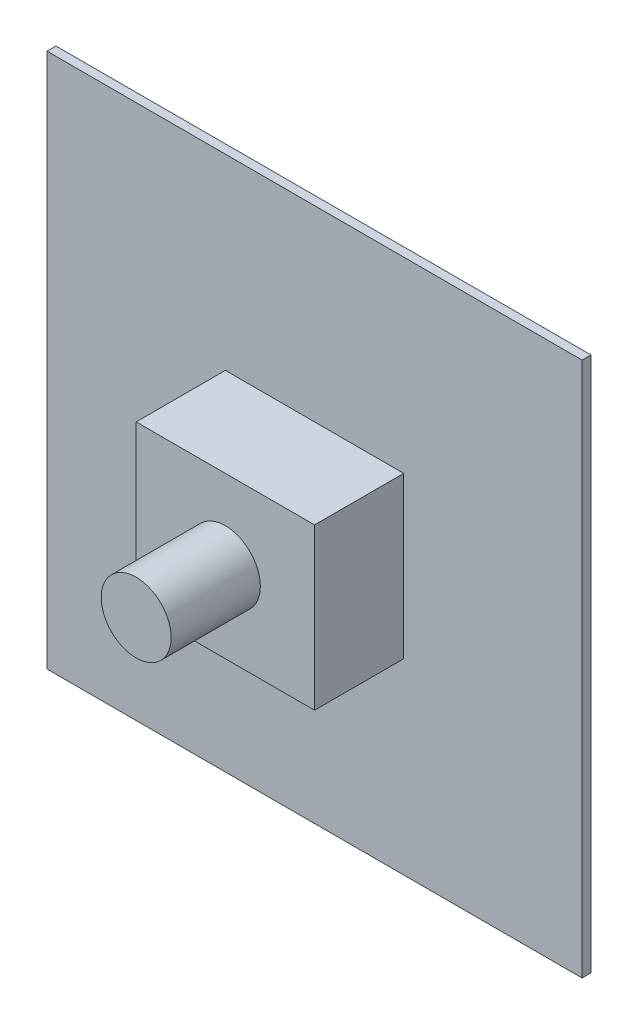
ISO-10303-21;
HEADER;
FILE_DESCRIPTION(('STEP AP214'),'2;1');
FILE_NAME('part.step','',(''),(''),'','','');
FILE_SCHEMA(('AUTOMOTIVE_DESIGN { 1 0 10303 214 1 1 1 1 }'));
ENDSEC;
DATA;
#1=APPLICATION_CONTEXT('core data for automotive mechanical design processes');
#2=APPLICATION_PROTOCOL_DEFINITION('international standard','automotive_design',2000,#1);
#3=PRODUCT_CONTEXT('',#1,'mechanical');
#4=PRODUCT('Part','Part','',(#3));
#5=PRODUCT_RELATED_PRODUCT_CATEGORY('part','',(#4));
#6=PRODUCT_DEFINITION_FORMATION('','',#4);
#7=PRODUCT_DEFINITION_CONTEXT('part definition',#1,'design');
#8=PRODUCT_DEFINITION('design','',#6,#7);
#9=PRODUCT_DEFINITION_SHAPE('','',#8);
#10=(LENGTH_UNIT() NAMED_UNIT(*) SI_UNIT(.MILLI.,.METRE.));
#11=(NAMED_UNIT(*) PLANE_ANGLE_UNIT() SI_UNIT($,.RADIAN.));
#12=(NAMED_UNIT(*) SI_UNIT($,.STERADIAN.) SOLID_ANGLE_UNIT());
#13=UNCERTAINTY_MEASURE_WITH_UNIT(LENGTH_MEASURE(1.E-05),#10,'distance_accuracy_value','');
#14=(GEOMETRIC_REPRESENTATION_CONTEXT(3) GLOBAL_UNCERTAINTY_ASSIGNED_CONTEXT((#13)) GLOBAL_UNIT_ASSIGNED_CONTEXT((#10,
#11,#12)) REPRESENTATION_CONTEXT('',''));
#15=CARTESIAN_POINT('',(0.,0.,0.));
#16=DIRECTION('',(0.,0.,1.));
#17=DIRECTION('',(1.,0.,0.));
#18=AXIS2_PLACEMENT_3D('',#15,#16,#17);
#19=CARTESIAN_POINT('',(0.,0.,50.));
#20=DIRECTION('',(0.,0.,1.));
#21=DIRECTION('',(1.,0.,0.));
#22=AXIS2_PLACEMENT_3D('',#19,#20,#21);
#23=PLANE('',#22);
#24=DIRECTION('',(0.,1.,0.));
#25=VECTOR('',#24,1.);
#26=CARTESIAN_POINT('',(1500.,1500.,50.));
#27=LINE('',#26,#25);
#28=CARTESIAN_POINT('',(1500.,-1500.,50.));
#29=VERTEX_POINT('',#28);
#30=CARTESIAN_POINT('',(1500.,1500.,50.));
#31=VERTEX_POINT('',#30);
#32=EDGE_CURVE('E140',#29,#31,#27,.T.);
#33=ORIENTED_EDGE('',*,*,#32,.T.);
#34=DIRECTION('',(-1.,0.,0.));
#35=VECTOR('',#34,1.);
#36=CARTESIAN_POINT('',(-1500.,1500.,50.));
#37=LINE('',#36,#35);
#38=CARTESIAN_POINT('',(-1500.,1500.,50.));
#39=VERTEX_POINT('',#38);
#40=EDGE_CURVE('E85',#31,#39,#37,.T.);
#41=ORIENTED_EDGE('',*,*,#40,.T.);
#42=DIRECTION('',(0.,-1.,0.));
#43=VECTOR('',#42,1.);
#44=CARTESIAN_POINT('',(-1500.,1500.,50.));
#45=LINE('',#44,#43);
#46=CARTESIAN_POINT('',(-1500.,-1500.,50.));
#47=VERTEX_POINT('',#46);
#48=EDGE_CURVE('E143',#39,#47,#45,.T.);
#49=ORIENTED_EDGE('',*,*,#48,.T.);
#50=DIRECTION('',(1.,0.,0.));
#51=VECTOR('',#50,1.);
#52=CARTESIAN_POINT('',(-1500.,-1500.,50.));
#53=LINE('',#52,#51);
#54=EDGE_CURVE('E57',#47,#29,#53,.T.);
#55=ORIENTED_EDGE('',*,*,#54,.T.);
#56=EDGE_LOOP('',(#33,#41,#49,#55));
#57=FACE_BOUND('',#56,.T.);
#58=DIRECTION('',(-1.,0.,0.));
#59=VECTOR('',#58,1.);
#60=CARTESIAN_POINT('',(-500.,450.,50.));
#61=LINE('',#60,#59);
#62=CARTESIAN_POINT('',(500.,450.,50.));
#63=VERTEX_POINT('',#62);
#64=CARTESIAN_POINT('',(-500.,450.,50.));
#65=VERTEX_POINT('',#64);
#66=EDGE_CURVE('E210',#63,#65,#61,.T.);
#67=ORIENTED_EDGE('',*,*,#66,.F.);
#68=DIRECTION('',(0.,1.,0.));
#69=VECTOR('',#68,1.);
#70=CARTESIAN_POINT('',(500.,450.,50.));
#71=LINE('',#70,#69);
#72=CARTESIAN_POINT('',(500.,-450.,50.));
#73=VERTEX_POINT('',#72);
#74=EDGE_CURVE('E130',#73,#63,#71,.T.);
#75=ORIENTED_EDGE('',*,*,#74,.F.);
#76=DIRECTION('',(1.,0.,0.));
#77=VECTOR('',#76,1.);
#78=CARTESIAN_POINT('',(-500.,-450.,50.));
#79=LINE('',#78,#77);
#80=CARTESIAN_POINT('',(-500.,-450.,50.));
#81=VERTEX_POINT('',#80);
#82=EDGE_CURVE('E126',#81,#73,#79,.T.);
#83=ORIENTED_EDGE('',*,*,#82,.F.);
#84=DIRECTION('',(0.,-1.,0.));
#85=VECTOR('',#84,1.);
#86=CARTESIAN_POINT('',(-500.,450.,50.));
#87=LINE('',#86,#85);
#88=EDGE_CURVE('E219',#65,#81,#87,.T.);
#89=ORIENTED_EDGE('',*,*,#88,.F.);
#90=EDGE_LOOP('',(#67,#75,#83,#89));
#91=FACE_BOUND('',#90,.T.);
#92=ADVANCED_FACE('F33',(#57,#91),#23,.T.);
#93=CARTESIAN_POINT('',(1500.,1500.,50.));
#94=DIRECTION('',(-1.,0.,0.));
#95=DIRECTION('',(0.,-1.,0.));
#96=AXIS2_PLACEMENT_3D('',#93,#94,#95);
#97=PLANE('',#96);
#98=DIRECTION('',(0.,1.,0.));
#99=VECTOR('',#98,1.);
#100=CARTESIAN_POINT('',(1500.,1500.,0.));
#101=LINE('',#100,#99);
#102=CARTESIAN_POINT('',(1500.,-1500.,0.));
#103=VERTEX_POINT('',#102);
#104=CARTESIAN_POINT('',(1500.,1500.,0.));
#105=VERTEX_POINT('',#104);
#106=EDGE_CURVE('E132',#103,#105,#101,.T.);
#107=ORIENTED_EDGE('',*,*,#106,.T.);
#108=DIRECTION('',(0.,0.,-1.));
#109=VECTOR('',#108,1.);
#110=CARTESIAN_POINT('',(1500.,1500.,50.));
#111=LINE('',#110,#109);
#112=EDGE_CURVE('E11',#31,#105,#111,.T.);
#113=ORIENTED_EDGE('',*,*,#112,.F.);
#114=ORIENTED_EDGE('',*,*,#32,.F.);
#115=DIRECTION('',(0.,0.,-1.));
#116=VECTOR('',#115,1.);
#117=CARTESIAN_POINT('',(1500.,-1500.,50.));
#118=LINE('',#117,#116);
#119=EDGE_CURVE('E145',#29,#103,#118,.T.);
#120=ORIENTED_EDGE('',*,*,#119,.T.);
#121=EDGE_LOOP('',(#107,#113,#114,#120));
#122=FACE_BOUND('',#121,.T.);
#123=ADVANCED_FACE('F35',(#122),#97,.F.);
#124=CARTESIAN_POINT('',(-1500.,1500.,50.));
#125=DIRECTION('',(0.,-1.,0.));
#126=DIRECTION('',(0.,0.,-1.));
#127=AXIS2_PLACEMENT_3D('',#124,#125,#126);
#128=PLANE('',#127);
#129=DIRECTION('',(-1.,0.,0.));
#130=VECTOR('',#129,1.);
#131=CARTESIAN_POINT('',(-1500.,1500.,0.));
#132=LINE('',#131,#130);
#133=CARTESIAN_POINT('',(-1500.,1500.,0.));
#134=VERTEX_POINT('',#133);
#135=EDGE_CURVE('E135',#105,#134,#132,.T.);
#136=ORIENTED_EDGE('',*,*,#135,.T.);
#137=DIRECTION('',(0.,0.,-1.));
#138=VECTOR('',#137,1.);
#139=CARTESIAN_POINT('',(-1500.,1500.,50.));
#140=LINE('',#139,#138);
#141=EDGE_CURVE('E41',#39,#134,#140,.T.);
#142=ORIENTED_EDGE('',*,*,#141,.F.);
#143=ORIENTED_EDGE('',*,*,#40,.F.);
#144=ORIENTED_EDGE('',*,*,#112,.T.);
#145=EDGE_LOOP('',(#136,#142,#143,#144));
#146=FACE_BOUND('',#145,.T.);
#147=ADVANCED_FACE('F173',(#146),#128,.F.);
#148=CARTESIAN_POINT('',(-1500.,1500.,50.));
#149=DIRECTION('',(1.,0.,0.));
#150=DIRECTION('',(0.,1.,0.));
#151=AXIS2_PLACEMENT_3D('',#148,#149,#150);
#152=PLANE('',#151);
#153=DIRECTION('',(0.,-1.,0.));
#154=VECTOR('',#153,1.);
#155=CARTESIAN_POINT('',(-1500.,1500.,0.));
#156=LINE('',#155,#154);
#157=CARTESIAN_POINT('',(-1500.,-1500.,0.));
#158=VERTEX_POINT('',#157);
#159=EDGE_CURVE('E148',#134,#158,#156,.T.);
#160=ORIENTED_EDGE('',*,*,#159,.T.);
#161=DIRECTION('',(0.,0.,-1.));
#162=VECTOR('',#161,1.);
#163=CARTESIAN_POINT('',(-1500.,-1500.,50.));
#164=LINE('',#163,#162);
#165=EDGE_CURVE('E152',#47,#158,#164,.T.);
#166=ORIENTED_EDGE('',*,*,#165,.F.);
#167=ORIENTED_EDGE('',*,*,#48,.F.);
#168=ORIENTED_EDGE('',*,*,#141,.T.);
#169=EDGE_LOOP('',(#160,#166,#167,#168));
#170=FACE_BOUND('',#169,.T.);
#171=ADVANCED_FACE('F157',(#170),#152,.F.);
#172=CARTESIAN_POINT('',(-1500.,-1500.,50.));
#173=DIRECTION('',(0.,1.,0.));
#174=DIRECTION('',(0.,0.,1.));
#175=AXIS2_PLACEMENT_3D('',#172,#173,#174);
#176=PLANE('',#175);
#177=DIRECTION('',(1.,0.,0.));
#178=VECTOR('',#177,1.);
#179=CARTESIAN_POINT('',(-1500.,-1500.,0.));
#180=LINE('',#179,#178);
#181=EDGE_CURVE('E78',#158,#103,#180,.T.);
#182=ORIENTED_EDGE('',*,*,#181,.T.);
#183=ORIENTED_EDGE('',*,*,#119,.F.);
#184=ORIENTED_EDGE('',*,*,#54,.F.);
#185=ORIENTED_EDGE('',*,*,#165,.T.);
#186=EDGE_LOOP('',(#182,#183,#184,#185));
#187=FACE_BOUND('',#186,.T.);
#188=ADVANCED_FACE('F165',(#187),#176,.F.);
#189=CARTESIAN_POINT('',(0.,0.,0.));
#190=DIRECTION('',(0.,0.,1.));
#191=DIRECTION('',(1.,0.,0.));
#192=AXIS2_PLACEMENT_3D('',#189,#190,#191);
#193=PLANE('',#192);
#194=ORIENTED_EDGE('',*,*,#106,.F.);
#195=ORIENTED_EDGE('',*,*,#181,.F.);
#196=ORIENTED_EDGE('',*,*,#159,.F.);
#197=ORIENTED_EDGE('',*,*,#135,.F.);
#198=EDGE_LOOP('',(#194,#195,#196,#197));
#199=FACE_BOUND('',#198,.T.);
#200=ADVANCED_FACE('F161',(#199),#193,.F.);
#201=CARTESIAN_POINT('',(500.,450.,550.));
#202=DIRECTION('',(-1.,0.,0.));
#203=DIRECTION('',(0.,0.,1.));
#204=AXIS2_PLACEMENT_3D('',#201,#202,#203);
#205=PLANE('',#204);
#206=ORIENTED_EDGE('',*,*,#74,.T.);
#207=DIRECTION('',(0.,0.,-1.));
#208=VECTOR('',#207,1.);
#209=CARTESIAN_POINT('',(500.,450.,550.));
#210=LINE('',#209,#208);
#211=CARTESIAN_POINT('',(500.,450.,550.));
#212=VERTEX_POINT('',#211);
#213=EDGE_CURVE('E111',#212,#63,#210,.T.);
#214=ORIENTED_EDGE('',*,*,#213,.F.);
#215=DIRECTION('',(0.,1.,0.));
#216=VECTOR('',#215,1.);
#217=CARTESIAN_POINT('',(500.,450.,550.));
#218=LINE('',#217,#216);
#219=CARTESIAN_POINT('',(500.,-450.,550.));
#220=VERTEX_POINT('',#219);
#221=EDGE_CURVE('E118',#220,#212,#218,.T.);
#222=ORIENTED_EDGE('',*,*,#221,.F.);
#223=DIRECTION('',(0.,0.,-1.));
#224=VECTOR('',#223,1.);
#225=CARTESIAN_POINT('',(500.,-450.,550.));
#226=LINE('',#225,#224);
#227=EDGE_CURVE('E216',#220,#73,#226,.T.);
#228=ORIENTED_EDGE('',*,*,#227,.T.);
#229=EDGE_LOOP('',(#206,#214,#222,#228));
#230=FACE_BOUND('',#229,.T.);
#231=ADVANCED_FACE('F128',(#230),#205,.F.);
#232=CARTESIAN_POINT('',(-500.,450.,550.));
#233=DIRECTION('',(0.,-1.,0.));
#234=DIRECTION('',(0.,0.,-1.));
#235=AXIS2_PLACEMENT_3D('',#232,#233,#234);
#236=PLANE('',#235);
#237=ORIENTED_EDGE('',*,*,#66,.T.);
#238=DIRECTION('',(0.,0.,-1.));
#239=VECTOR('',#238,1.);
#240=CARTESIAN_POINT('',(-500.,450.,550.));
#241=LINE('',#240,#239);
#242=CARTESIAN_POINT('',(-500.,450.,550.));
#243=VERTEX_POINT('',#242);
#244=EDGE_CURVE('E114',#243,#65,#241,.T.);
#245=ORIENTED_EDGE('',*,*,#244,.F.);
#246=DIRECTION('',(-1.,0.,0.));
#247=VECTOR('',#246,1.);
#248=CARTESIAN_POINT('',(-500.,450.,550.));
#249=LINE('',#248,#247);
#250=EDGE_CURVE('E107',#212,#243,#249,.T.);
#251=ORIENTED_EDGE('',*,*,#250,.F.);
#252=ORIENTED_EDGE('',*,*,#213,.T.);
#253=EDGE_LOOP('',(#237,#245,#251,#252));
#254=FACE_BOUND('',#253,.T.);
#255=ADVANCED_FACE('F109',(#254),#236,.F.);
#256=CARTESIAN_POINT('',(-500.,450.,550.));
#257=DIRECTION('',(1.,0.,0.));
#258=DIRECTION('',(0.,1.,0.));
#259=AXIS2_PLACEMENT_3D('',#256,#257,#258);
#260=PLANE('',#259);
#261=ORIENTED_EDGE('',*,*,#88,.T.);
#262=DIRECTION('',(0.,0.,-1.));
#263=VECTOR('',#262,1.);
#264=CARTESIAN_POINT('',(-500.,-450.,550.));
#265=LINE('',#264,#263);
#266=CARTESIAN_POINT('',(-500.,-450.,550.));
#267=VERTEX_POINT('',#266);
#268=EDGE_CURVE('E48',#267,#81,#265,.T.);
#269=ORIENTED_EDGE('',*,*,#268,.F.);
#270=DIRECTION('',(0.,-1.,0.));
#271=VECTOR('',#270,1.);
#272=CARTESIAN_POINT('',(-500.,450.,550.));
#273=LINE('',#272,#271);
#274=EDGE_CURVE('E117',#243,#267,#273,.T.);
#275=ORIENTED_EDGE('',*,*,#274,.F.);
#276=ORIENTED_EDGE('',*,*,#244,.T.);
#277=EDGE_LOOP('',(#261,#269,#275,#276));
#278=FACE_BOUND('',#277,.T.);
#279=ADVANCED_FACE('F186',(#278),#260,.F.);
#280=CARTESIAN_POINT('',(-500.,-450.,550.));
#281=DIRECTION('',(0.,1.,0.));
#282=DIRECTION('',(0.,0.,1.));
#283=AXIS2_PLACEMENT_3D('',#280,#281,#282);
#284=PLANE('',#283);
#285=ORIENTED_EDGE('',*,*,#82,.T.);
#286=ORIENTED_EDGE('',*,*,#227,.F.);
#287=DIRECTION('',(1.,0.,0.));
#288=VECTOR('',#287,1.);
#289=CARTESIAN_POINT('',(-500.,-450.,550.));
#290=LINE('',#289,#288);
#291=EDGE_CURVE('E122',#267,#220,#290,.T.);
#292=ORIENTED_EDGE('',*,*,#291,.F.);
#293=ORIENTED_EDGE('',*,*,#268,.T.);
#294=EDGE_LOOP('',(#285,#286,#292,#293));
#295=FACE_BOUND('',#294,.T.);
#296=ADVANCED_FACE('F189',(#295),#284,.F.);
#297=CARTESIAN_POINT('',(0.,0.,550.));
#298=DIRECTION('',(0.,0.,1.));
#299=DIRECTION('',(1.,0.,0.));
#300=AXIS2_PLACEMENT_3D('',#297,#298,#299);
#301=PLANE('',#300);
#302=CARTESIAN_POINT('',(0.,0.,550.));
#303=DIRECTION('',(0.,0.,1.));
#304=DIRECTION('',(1.,0.,0.));
#305=AXIS2_PLACEMENT_3D('',#302,#303,#304);
#306=CIRCLE('',#305,196.131085290645);
#307=CARTESIAN_POINT('',(196.131085290645,0.,550.));
#308=VERTEX_POINT('',#307);
#309=EDGE_CURVE('E208',#308,#308,#306,.T.);
#310=ORIENTED_EDGE('',*,*,#309,.F.);
#311=EDGE_LOOP('',(#310));
#312=FACE_BOUND('',#311,.T.);
#313=ORIENTED_EDGE('',*,*,#221,.T.);
#314=ORIENTED_EDGE('',*,*,#250,.T.);
#315=ORIENTED_EDGE('',*,*,#274,.T.);
#316=ORIENTED_EDGE('',*,*,#291,.T.);
#317=EDGE_LOOP('',(#313,#314,#315,#316));
#318=FACE_BOUND('',#317,.T.);
#319=ADVANCED_FACE('F121',(#312,#318),#301,.T.);
#320=CARTESIAN_POINT('',(0.,0.,1050.));
#321=DIRECTION('',(0.,0.,-1.));
#322=DIRECTION('',(-1.,0.,0.));
#323=AXIS2_PLACEMENT_3D('',#320,#321,#322);
#324=CYLINDRICAL_SURFACE('',#323,196.131085290645);
#325=CARTESIAN_POINT('',(0.,0.,1050.));
#326=DIRECTION('',(0.,0.,1.));
#327=DIRECTION('',(1.,0.,0.));
#328=AXIS2_PLACEMENT_3D('',#325,#326,#327);
#329=CIRCLE('',#328,196.131085290645);
#330=CARTESIAN_POINT('',(196.131085290645,0.,1050.));
#331=VERTEX_POINT('',#330);
#332=EDGE_CURVE('E207',#331,#331,#329,.T.);
#333=ORIENTED_EDGE('',*,*,#332,.F.);
#334=EDGE_LOOP('',(#333));
#335=FACE_BOUND('',#334,.T.);
#336=ORIENTED_EDGE('',*,*,#309,.T.);
#337=EDGE_LOOP('',(#336));
#338=FACE_BOUND('',#337,.T.);
#339=ADVANCED_FACE('F195',(#335,#338),#324,.T.);
#340=CARTESIAN_POINT('',(0.,0.,1050.));
#341=DIRECTION('',(0.,0.,1.));
#342=DIRECTION('',(1.,0.,0.));
#343=AXIS2_PLACEMENT_3D('',#340,#341,#342);
#344=PLANE('',#343);
#345=ORIENTED_EDGE('',*,*,#332,.T.);
#346=EDGE_LOOP('',(#345));
#347=FACE_BOUND('',#346,.T.);
#348=ADVANCED_FACE('F199',(#347),#344,.T.);
#349=CLOSED_SHELL('',(#92,#123,#147,#171,#188,#200,#231,#255,#279,#296,#319,#339,#348));
#350=MANIFOLD_SOLID_BREP('B2',#349);
#351=ADVANCED_BREP_SHAPE_REPRESENTATION('',(#18,#350),#14);
#352=SHAPE_DEFINITION_REPRESENTATION(#9,#351);
ENDSEC;
END-ISO-10303-21;
